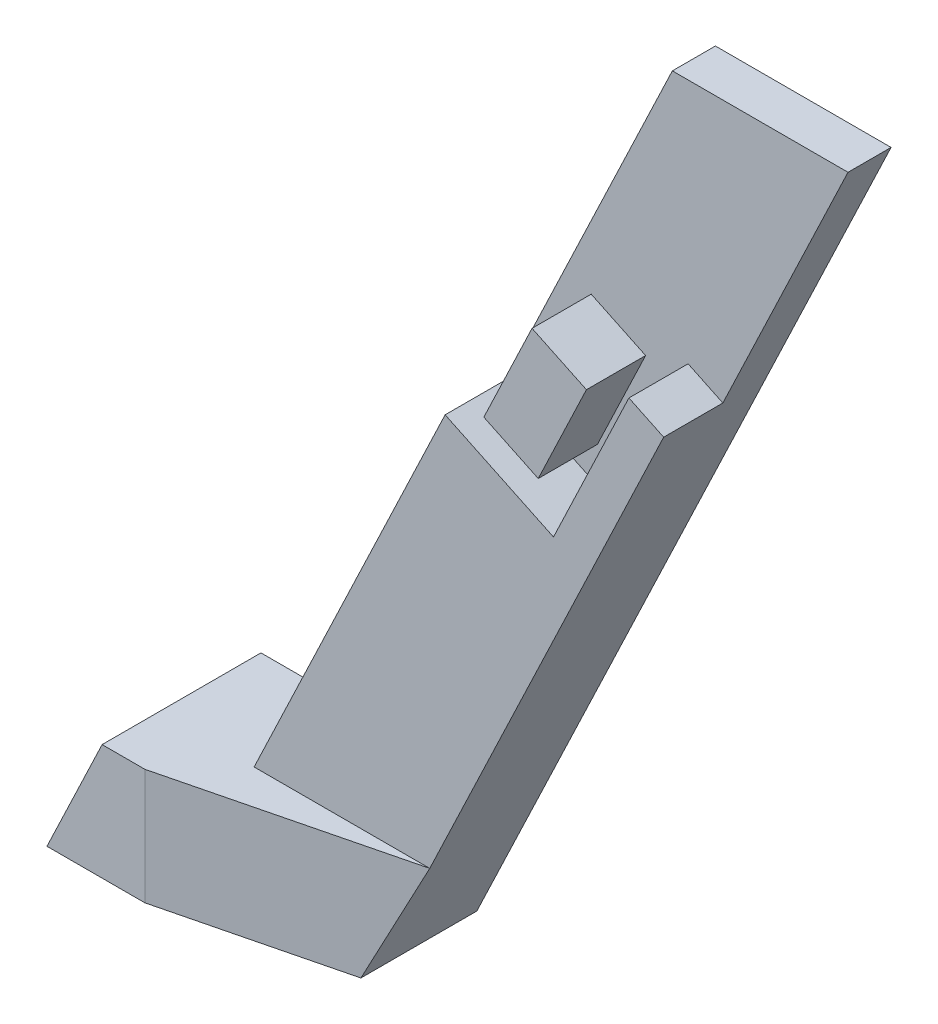
ISO-10303-21;
HEADER;
FILE_DESCRIPTION(('STEP AP214'),'2;1');
FILE_NAME('part.step','',(''),(''),'','','');
FILE_SCHEMA(('AUTOMOTIVE_DESIGN { 1 0 10303 214 1 1 1 1 }'));
ENDSEC;
DATA;
#1=APPLICATION_CONTEXT('core data for automotive mechanical design processes');
#2=APPLICATION_PROTOCOL_DEFINITION('international standard','automotive_design',2000,#1);
#3=PRODUCT_CONTEXT('',#1,'mechanical');
#4=PRODUCT('Part','Part','',(#3));
#5=PRODUCT_RELATED_PRODUCT_CATEGORY('part','',(#4));
#6=PRODUCT_DEFINITION_FORMATION('','',#4);
#7=PRODUCT_DEFINITION_CONTEXT('part definition',#1,'design');
#8=PRODUCT_DEFINITION('design','',#6,#7);
#9=PRODUCT_DEFINITION_SHAPE('','',#8);
#10=(LENGTH_UNIT() NAMED_UNIT(*) SI_UNIT(.MILLI.,.METRE.));
#11=(NAMED_UNIT(*) PLANE_ANGLE_UNIT() SI_UNIT($,.RADIAN.));
#12=(NAMED_UNIT(*) SI_UNIT($,.STERADIAN.) SOLID_ANGLE_UNIT());
#13=UNCERTAINTY_MEASURE_WITH_UNIT(LENGTH_MEASURE(1.E-05),#10,'distance_accuracy_value','');
#14=(GEOMETRIC_REPRESENTATION_CONTEXT(3) GLOBAL_UNCERTAINTY_ASSIGNED_CONTEXT((#13)) GLOBAL_UNIT_ASSIGNED_CONTEXT((#10,
#11,#12)) REPRESENTATION_CONTEXT('',''));
#15=CARTESIAN_POINT('',(0.,0.,0.));
#16=DIRECTION('',(0.,0.,1.));
#17=DIRECTION('',(1.,0.,0.));
#18=AXIS2_PLACEMENT_3D('',#15,#16,#17);
#19=CARTESIAN_POINT('',(6.79806732335556,55.3855791169411,28.9030453567871));
#20=DIRECTION('',(0.,0.,-1.));
#21=DIRECTION('',(-1.,0.,0.));
#22=AXIS2_PLACEMENT_3D('',#19,#20,#21);
#23=PLANE('',#22);
#24=DIRECTION('',(-1.,0.,0.));
#25=VECTOR('',#24,1.);
#26=CARTESIAN_POINT('',(6.79806732335556,45.3855791169411,28.9030453567871));
#27=LINE('',#26,#25);
#28=CARTESIAN_POINT('',(23.1199205917161,45.3855791169411,28.9030453567871));
#29=VERTEX_POINT('',#28);
#30=CARTESIAN_POINT('',(6.79806732335556,45.3855791169411,28.9030453567871));
#31=VERTEX_POINT('',#30);
#32=EDGE_CURVE('E187',#29,#31,#27,.T.);
#33=ORIENTED_EDGE('',*,*,#32,.T.);
#34=DIRECTION('',(-0.43051109680829,-0.902585284349863,0.));
#35=VECTOR('',#34,1.);
#36=CARTESIAN_POINT('',(6.79806732335556,45.3855791169411,28.9030453567871));
#37=LINE('',#36,#35);
#38=CARTESIAN_POINT('',(-8.81560558331229,12.6508331262096,28.9030453567871));
#39=VERTEX_POINT('',#38);
#40=EDGE_CURVE('E192',#31,#39,#37,.T.);
#41=ORIENTED_EDGE('',*,*,#40,.T.);
#42=DIRECTION('',(0.902585284349865,-0.430511096808287,0.));
#43=VECTOR('',#42,1.);
#44=CARTESIAN_POINT('',(3.28188932140938,6.88062404971684,28.9030453567871));
#45=LINE('',#44,#43);
#46=CARTESIAN_POINT('',(1.25181873792912,7.84891804768718,28.9030453567871));
#47=VERTEX_POINT('',#46);
#48=EDGE_CURVE('E214',#39,#47,#45,.T.);
#49=ORIENTED_EDGE('',*,*,#48,.T.);
#50=DIRECTION('',(0.430511106661755,0.902585279650001,0.));
#51=VECTOR('',#50,1.);
#52=CARTESIAN_POINT('',(-2.0300706480248,0.96829405596068,28.9030453567871));
#53=LINE('',#52,#51);
#54=CARTESIAN_POINT('',(8.26092366574488,22.5438117065847,28.9030453567871));
#55=VERTEX_POINT('',#54);
#56=EDGE_CURVE('E223',#47,#55,#53,.T.);
#57=ORIENTED_EDGE('',*,*,#56,.T.);
#58=DIRECTION('',(0.902585284349863,-0.43051109680829,0.));
#59=VECTOR('',#58,1.);
#60=CARTESIAN_POINT('',(10.290994088802,21.5755177851323,28.9030453567871));
#61=LINE('',#60,#59);
#62=CARTESIAN_POINT('',(11.4902633590119,21.0034956861254,28.9030453567871));
#63=VERTEX_POINT('',#62);
#64=EDGE_CURVE('E221',#55,#63,#61,.T.);
#65=ORIENTED_EDGE('',*,*,#64,.T.);
#66=DIRECTION('',(0.430511096808289,0.902585284349863,0.));
#67=VECTOR('',#66,1.);
#68=CARTESIAN_POINT('',(-15.3714022019898,-35.3131573066409,28.9030453567871));
#69=LINE('',#68,#67);
#70=EDGE_CURVE('E196',#63,#29,#69,.T.);
#71=ORIENTED_EDGE('',*,*,#70,.T.);
#72=EDGE_LOOP('',(#33,#41,#49,#57,#65,#71));
#73=FACE_BOUND('',#72,.T.);
#74=DIRECTION('',(0.902585284349863,-0.430511096808291,0.));
#75=VECTOR('',#74,1.);
#76=CARTESIAN_POINT('',(4.57342261183424,9.58837990276632,28.9030453567871));
#77=LINE('',#76,#75);
#78=CARTESIAN_POINT('',(-5.21888141705454,14.2590693332878,28.9030453567871));
#79=VERTEX_POINT('',#78);
#80=CARTESIAN_POINT('',(-0.164403824695319,11.8482071911614,28.9030453567871));
#81=VERTEX_POINT('',#80);
#82=EDGE_CURVE('E306',#79,#81,#77,.T.);
#83=ORIENTED_EDGE('',*,*,#82,.F.);
#84=DIRECTION('',(-0.430511096808287,-0.902585284349865,0.));
#85=VECTOR('',#84,1.);
#86=CARTESIAN_POINT('',(-9.79230402888876,4.67068943052144,28.9030453567871));
#87=LINE('',#86,#85);
#88=CARTESIAN_POINT('',(-0.741566010248357,23.6459562905264,28.9030453567871));
#89=VERTEX_POINT('',#88);
#90=EDGE_CURVE('E216',#89,#79,#87,.T.);
#91=ORIENTED_EDGE('',*,*,#90,.F.);
#92=DIRECTION('',(-0.902585284349863,0.430511096808291,0.));
#93=VECTOR('',#92,1.);
#94=CARTESIAN_POINT('',(9.05073801864047,18.9752668600049,28.9030453567871));
#95=LINE('',#94,#93);
#96=CARTESIAN_POINT('',(4.31291158211089,21.2350941484,28.9030453567871));
#97=VERTEX_POINT('',#96);
#98=EDGE_CURVE('E313',#97,#89,#95,.T.);
#99=ORIENTED_EDGE('',*,*,#98,.F.);
#100=DIRECTION('',(0.430511096808289,0.902585284349863,0.));
#101=VECTOR('',#100,1.);
#102=CARTESIAN_POINT('',(-4.73782643652955,2.25982728839507,28.9030453567871));
#103=LINE('',#102,#101);
#104=EDGE_CURVE('E315',#81,#97,#103,.T.);
#105=ORIENTED_EDGE('',*,*,#104,.F.);
#106=EDGE_LOOP('',(#83,#91,#99,#105));
#107=FACE_BOUND('',#106,.T.);
#108=ADVANCED_FACE('F77',(#73,#107),#23,.F.);
#109=CARTESIAN_POINT('',(6.79806732335556,45.3855791169411,28.9030453567871));
#110=DIRECTION('',(0.,1.,0.));
#111=DIRECTION('',(0.,0.,-1.));
#112=AXIS2_PLACEMENT_3D('',#109,#110,#111);
#113=PLANE('',#112);
#114=DIRECTION('',(-1.,0.,0.));
#115=VECTOR('',#114,1.);
#116=CARTESIAN_POINT('',(6.79806732335556,45.3855791169411,24.9030453567871));
#117=LINE('',#116,#115);
#118=CARTESIAN_POINT('',(23.1199205917161,45.3855791169411,24.9030453567871));
#119=VERTEX_POINT('',#118);
#120=CARTESIAN_POINT('',(6.79806732335556,45.3855791169411,24.9030453567871));
#121=VERTEX_POINT('',#120);
#122=EDGE_CURVE('E204',#119,#121,#117,.T.);
#123=ORIENTED_EDGE('',*,*,#122,.T.);
#124=DIRECTION('',(0.,0.,-1.));
#125=VECTOR('',#124,1.);
#126=CARTESIAN_POINT('',(6.79806732335556,45.3855791169411,28.9030453567871));
#127=LINE('',#126,#125);
#128=EDGE_CURVE('E201',#31,#121,#127,.T.);
#129=ORIENTED_EDGE('',*,*,#128,.F.);
#130=ORIENTED_EDGE('',*,*,#32,.F.);
#131=DIRECTION('',(0.,0.,-1.));
#132=VECTOR('',#131,1.);
#133=CARTESIAN_POINT('',(23.1199205917161,45.3855791169411,28.9030453567871));
#134=LINE('',#133,#132);
#135=EDGE_CURVE('E208',#29,#119,#134,.T.);
#136=ORIENTED_EDGE('',*,*,#135,.T.);
#137=EDGE_LOOP('',(#123,#129,#130,#136));
#138=FACE_BOUND('',#137,.T.);
#139=ADVANCED_FACE('F202',(#138),#113,.T.);
#140=CARTESIAN_POINT('',(-15.3714022019898,-35.3131573066409,28.9030453567871));
#141=DIRECTION('',(0.902585284349863,-0.430511096808289,0.));
#142=DIRECTION('',(0.430511096808289,0.902585284349863,0.));
#143=AXIS2_PLACEMENT_3D('',#140,#141,#142);
#144=PLANE('',#143);
#145=DIRECTION('',(-0.428076885082601,-0.897481853337546,0.10619088184859));
#146=VECTOR('',#145,1.);
#147=CARTESIAN_POINT('',(-15.0635706334285,-34.6677750019764,35.5984835481295));
#148=LINE('',#147,#146);
#149=CARTESIAN_POINT('',(-10.2445179205198,-24.564420883059,34.4030453567871));
#150=VERTEX_POINT('',#149);
#151=CARTESIAN_POINT('',(-15.3714022019898,-35.3131573066409,35.6748457785266));
#152=VERTEX_POINT('',#151);
#153=EDGE_CURVE('E207',#150,#152,#148,.T.);
#154=ORIENTED_EDGE('',*,*,#153,.T.);
#155=DIRECTION('',(0.,0.,-1.));
#156=VECTOR('',#155,1.);
#157=CARTESIAN_POINT('',(-15.3714022019898,-35.3131573066409,28.9030453567871));
#158=LINE('',#157,#156);
#159=CARTESIAN_POINT('',(-15.3714022019898,-35.3131573066409,24.9030453567871));
#160=VERTEX_POINT('',#159);
#161=EDGE_CURVE('E237',#152,#160,#158,.T.);
#162=ORIENTED_EDGE('',*,*,#161,.T.);
#163=DIRECTION('',(0.430511096808289,0.902585284349863,0.));
#164=VECTOR('',#163,1.);
#165=CARTESIAN_POINT('',(-15.3714022019898,-35.3131573066409,24.9030453567871));
#166=LINE('',#165,#164);
#167=EDGE_CURVE('E235',#160,#119,#166,.T.);
#168=ORIENTED_EDGE('',*,*,#167,.T.);
#169=ORIENTED_EDGE('',*,*,#135,.F.);
#170=ORIENTED_EDGE('',*,*,#70,.F.);
#171=DIRECTION('',(0.,0.,-1.));
#172=VECTOR('',#171,1.);
#173=CARTESIAN_POINT('',(11.4902633590119,21.0034956861254,112.225365897655));
#174=LINE('',#173,#172);
#175=CARTESIAN_POINT('',(11.4902633590119,21.0034956861254,34.4030453567871));
#176=VERTEX_POINT('',#175);
#177=EDGE_CURVE('E233',#176,#63,#174,.T.);
#178=ORIENTED_EDGE('',*,*,#177,.F.);
#179=DIRECTION('',(-0.430511096808289,-0.902585284349864,0.));
#180=VECTOR('',#179,1.);
#181=CARTESIAN_POINT('',(1.19926927021,-0.572022099006938,34.4030453567871));
#182=LINE('',#181,#180);
#183=EDGE_CURVE('E230',#176,#150,#182,.T.);
#184=ORIENTED_EDGE('',*,*,#183,.T.);
#185=EDGE_LOOP('',(#154,#162,#168,#169,#170,#178,#184));
#186=FACE_BOUND('',#185,.T.);
#187=ADVANCED_FACE('F339',(#186),#144,.T.);
#188=CARTESIAN_POINT('',(-40.55668382301,-35.3131573066409,28.9030453567871));
#189=DIRECTION('',(0.,-1.,0.));
#190=DIRECTION('',(0.,0.,1.));
#191=AXIS2_PLACEMENT_3D('',#188,#189,#190);
#192=PLANE('',#191);
#193=DIRECTION('',(-0.970582796133083,0.,0.240767597177209));
#194=VECTOR('',#193,1.);
#195=CARTESIAN_POINT('',(-31.4486399349221,-35.3131573066409,39.6630453567871));
#196=LINE('',#195,#194);
#197=CARTESIAN_POINT('',(-31.4486399349221,-35.313157306641,39.6630453567871));
#198=VERTEX_POINT('',#197);
#199=EDGE_CURVE('E240',#152,#198,#196,.T.);
#200=ORIENTED_EDGE('',*,*,#199,.T.);
#201=DIRECTION('',(-1.,0.,0.));
#202=VECTOR('',#201,1.);
#203=CARTESIAN_POINT('',(-15.3714022019898,-35.3131573066409,39.6630453567871));
#204=LINE('',#203,#202);
#205=CARTESIAN_POINT('',(-40.55668382301,-35.313157306641,39.6630453567871));
#206=VERTEX_POINT('',#205);
#207=EDGE_CURVE('E248',#198,#206,#204,.T.);
#208=ORIENTED_EDGE('',*,*,#207,.T.);
#209=DIRECTION('',(0.,0.,-1.));
#210=VECTOR('',#209,1.);
#211=CARTESIAN_POINT('',(-40.55668382301,-35.3131573066409,28.9030453567871));
#212=LINE('',#211,#210);
#213=CARTESIAN_POINT('',(-40.55668382301,-35.3131573066409,24.9030453567871));
#214=VERTEX_POINT('',#213);
#215=EDGE_CURVE('E245',#206,#214,#212,.T.);
#216=ORIENTED_EDGE('',*,*,#215,.T.);
#217=DIRECTION('',(1.,0.,0.));
#218=VECTOR('',#217,1.);
#219=CARTESIAN_POINT('',(-40.55668382301,-35.3131573066409,24.9030453567871));
#220=LINE('',#219,#218);
#221=EDGE_CURVE('E243',#214,#160,#220,.T.);
#222=ORIENTED_EDGE('',*,*,#221,.T.);
#223=ORIENTED_EDGE('',*,*,#161,.F.);
#224=EDGE_LOOP('',(#200,#208,#216,#222,#223));
#225=FACE_BOUND('',#224,.T.);
#226=ADVANCED_FACE('F344',(#225),#192,.T.);
#227=CARTESIAN_POINT('',(-35.4297995415399,-24.564420883059,28.9030453567871));
#228=DIRECTION('',(-0.902585284349863,0.43051109680829,0.));
#229=DIRECTION('',(-0.43051109680829,-0.902585284349863,0.));
#230=AXIS2_PLACEMENT_3D('',#227,#228,#229);
#231=PLANE('',#230);
#232=DIRECTION('',(-0.430511096808289,-0.902585284349863,0.));
#233=VECTOR('',#232,1.);
#234=CARTESIAN_POINT('',(-35.4297995415399,-24.564420883059,24.9030453567871));
#235=LINE('',#234,#233);
#236=CARTESIAN_POINT('',(-35.4297995415399,-24.564420883059,24.9030453567871));
#237=VERTEX_POINT('',#236);
#238=EDGE_CURVE('E251',#237,#214,#235,.T.);
#239=ORIENTED_EDGE('',*,*,#238,.T.);
#240=ORIENTED_EDGE('',*,*,#215,.F.);
#241=DIRECTION('',(0.430511096808289,0.902585284349863,0.));
#242=VECTOR('',#241,1.);
#243=CARTESIAN_POINT('',(-40.55668382301,-35.313157306641,39.6630453567871));
#244=LINE('',#243,#242);
#245=CARTESIAN_POINT('',(-35.4297995415399,-24.564420883059,39.6630453567871));
#246=VERTEX_POINT('',#245);
#247=EDGE_CURVE('E256',#206,#246,#244,.T.);
#248=ORIENTED_EDGE('',*,*,#247,.T.);
#249=DIRECTION('',(0.,0.,-1.));
#250=VECTOR('',#249,1.);
#251=CARTESIAN_POINT('',(-35.4297995415399,-24.564420883059,28.9030453567871));
#252=LINE('',#251,#250);
#253=EDGE_CURVE('E253',#246,#237,#252,.T.);
#254=ORIENTED_EDGE('',*,*,#253,.T.);
#255=EDGE_LOOP('',(#239,#240,#248,#254));
#256=FACE_BOUND('',#255,.T.);
#257=ADVANCED_FACE('F350',(#256),#231,.T.);
#258=CARTESIAN_POINT('',(-26.5663711888802,-24.564420883059,28.9030453567871));
#259=DIRECTION('',(0.,1.,0.));
#260=DIRECTION('',(0.,0.,-1.));
#261=AXIS2_PLACEMENT_3D('',#258,#259,#260);
#262=PLANE('',#261);
#263=DIRECTION('',(0.970582796133083,0.,-0.240767597177209));
#264=VECTOR('',#263,1.);
#265=CARTESIAN_POINT('',(-24.3349422093445,-24.564420883059,37.8983861074618));
#266=LINE('',#265,#264);
#267=CARTESIAN_POINT('',(-31.4486399349221,-24.564420883059,39.6630453567871));
#268=VERTEX_POINT('',#267);
#269=EDGE_CURVE('E259',#268,#150,#266,.T.);
#270=ORIENTED_EDGE('',*,*,#269,.T.);
#271=DIRECTION('',(1.,0.,0.));
#272=VECTOR('',#271,1.);
#273=CARTESIAN_POINT('',(-35.4297995415399,-24.564420883059,34.4030453567871));
#274=LINE('',#273,#272);
#275=CARTESIAN_POINT('',(-26.5663711888802,-24.564420883059,34.4030453567871));
#276=VERTEX_POINT('',#275);
#277=EDGE_CURVE('E270',#276,#150,#274,.T.);
#278=ORIENTED_EDGE('',*,*,#277,.F.);
#279=DIRECTION('',(0.,0.,-1.));
#280=VECTOR('',#279,1.);
#281=CARTESIAN_POINT('',(-26.5663711888802,-24.564420883059,28.9030453567871));
#282=LINE('',#281,#280);
#283=CARTESIAN_POINT('',(-26.5663711888802,-24.564420883059,24.9030453567871));
#284=VERTEX_POINT('',#283);
#285=EDGE_CURVE('E267',#276,#284,#282,.T.);
#286=ORIENTED_EDGE('',*,*,#285,.T.);
#287=DIRECTION('',(-1.,0.,0.));
#288=VECTOR('',#287,1.);
#289=CARTESIAN_POINT('',(-26.5663711888802,-24.564420883059,24.9030453567871));
#290=LINE('',#289,#288);
#291=EDGE_CURVE('E265',#284,#237,#290,.T.);
#292=ORIENTED_EDGE('',*,*,#291,.T.);
#293=ORIENTED_EDGE('',*,*,#253,.F.);
#294=DIRECTION('',(1.,0.,0.));
#295=VECTOR('',#294,1.);
#296=CARTESIAN_POINT('',(-35.4297995415399,-24.564420883059,39.6630453567871));
#297=LINE('',#296,#295);
#298=EDGE_CURVE('E262',#246,#268,#297,.T.);
#299=ORIENTED_EDGE('',*,*,#298,.T.);
#300=EDGE_LOOP('',(#270,#278,#286,#292,#293,#299));
#301=FACE_BOUND('',#300,.T.);
#302=ADVANCED_FACE('F354',(#301),#262,.T.);
#303=CARTESIAN_POINT('',(6.79806732335556,45.3855791169411,28.9030453567871));
#304=DIRECTION('',(-0.902585284349863,0.43051109680829,0.));
#305=DIRECTION('',(-0.43051109680829,-0.902585284349863,0.));
#306=AXIS2_PLACEMENT_3D('',#303,#304,#305);
#307=PLANE('',#306);
#308=DIRECTION('',(-0.43051109680829,-0.902585284349863,0.));
#309=VECTOR('',#308,1.);
#310=CARTESIAN_POINT('',(6.79806732335556,45.3855791169411,24.9030453567871));
#311=LINE('',#310,#309);
#312=EDGE_CURVE('E272',#121,#284,#311,.T.);
#313=ORIENTED_EDGE('',*,*,#312,.T.);
#314=ORIENTED_EDGE('',*,*,#285,.F.);
#315=DIRECTION('',(0.43051109680829,0.902585284349863,0.));
#316=VECTOR('',#315,1.);
#317=CARTESIAN_POINT('',(-12.0974949047217,5.77020907649281,34.4030453567871));
#318=LINE('',#317,#316);
#319=CARTESIAN_POINT('',(-8.81560558331229,12.6508331262096,34.4030453567871));
#320=VERTEX_POINT('',#319);
#321=EDGE_CURVE('E275',#276,#320,#318,.T.);
#322=ORIENTED_EDGE('',*,*,#321,.T.);
#323=DIRECTION('',(0.,0.,-1.));
#324=VECTOR('',#323,1.);
#325=CARTESIAN_POINT('',(-8.81560558331229,12.6508331262096,112.225365897655));
#326=LINE('',#325,#324);
#327=EDGE_CURVE('E213',#320,#39,#326,.T.);
#328=ORIENTED_EDGE('',*,*,#327,.T.);
#329=ORIENTED_EDGE('',*,*,#40,.F.);
#330=ORIENTED_EDGE('',*,*,#128,.T.);
#331=EDGE_LOOP('',(#313,#314,#322,#328,#329,#330));
#332=FACE_BOUND('',#331,.T.);
#333=ADVANCED_FACE('F210',(#332),#307,.T.);
#334=CARTESIAN_POINT('',(0.,0.,24.9030453567871));
#335=DIRECTION('',(0.,0.,-1.));
#336=DIRECTION('',(1.,0.,0.));
#337=AXIS2_PLACEMENT_3D('',#334,#335,#336);
#338=PLANE('',#337);
#339=ORIENTED_EDGE('',*,*,#312,.F.);
#340=ORIENTED_EDGE('',*,*,#122,.F.);
#341=ORIENTED_EDGE('',*,*,#167,.F.);
#342=ORIENTED_EDGE('',*,*,#221,.F.);
#343=ORIENTED_EDGE('',*,*,#238,.F.);
#344=ORIENTED_EDGE('',*,*,#291,.F.);
#345=EDGE_LOOP('',(#339,#340,#341,#342,#343,#344));
#346=FACE_BOUND('',#345,.T.);
#347=ADVANCED_FACE('F361',(#346),#338,.T.);
#348=CARTESIAN_POINT('',(-2.0300706480248,0.96829405596068,112.225365897655));
#349=DIRECTION('',(0.902585279650001,-0.430511106661755,0.));
#350=DIRECTION('',(0.430511106661755,0.902585279650001,0.));
#351=AXIS2_PLACEMENT_3D('',#348,#349,#350);
#352=PLANE('',#351);
#353=DIRECTION('',(0.430511106661755,0.902585279650001,0.));
#354=VECTOR('',#353,1.);
#355=CARTESIAN_POINT('',(-2.0300706480248,0.96829405596068,34.4030453567871));
#356=LINE('',#355,#354);
#357=CARTESIAN_POINT('',(1.25181873792912,7.84891804768718,34.4030453567871));
#358=VERTEX_POINT('',#357);
#359=CARTESIAN_POINT('',(8.26092366574488,22.5438117065847,34.4030453567871));
#360=VERTEX_POINT('',#359);
#361=EDGE_CURVE('E277',#358,#360,#356,.T.);
#362=ORIENTED_EDGE('',*,*,#361,.T.);
#363=DIRECTION('',(0.,0.,-1.));
#364=VECTOR('',#363,1.);
#365=CARTESIAN_POINT('',(8.26092366574488,22.5438117065847,112.225365897655));
#366=LINE('',#365,#364);
#367=EDGE_CURVE('E282',#360,#55,#366,.T.);
#368=ORIENTED_EDGE('',*,*,#367,.T.);
#369=ORIENTED_EDGE('',*,*,#56,.F.);
#370=DIRECTION('',(0.,0.,-1.));
#371=VECTOR('',#370,1.);
#372=CARTESIAN_POINT('',(1.25181873792912,7.84891804768718,112.225365897655));
#373=LINE('',#372,#371);
#374=EDGE_CURVE('E280',#358,#47,#373,.T.);
#375=ORIENTED_EDGE('',*,*,#374,.F.);
#376=EDGE_LOOP('',(#362,#368,#369,#375));
#377=FACE_BOUND('',#376,.T.);
#378=ADVANCED_FACE('F364',(#377),#352,.F.);
#379=CARTESIAN_POINT('',(10.290994088802,21.5755177851323,112.225365897655));
#380=DIRECTION('',(-0.43051109680829,-0.902585284349863,0.));
#381=DIRECTION('',(0.902585284349863,-0.43051109680829,0.));
#382=AXIS2_PLACEMENT_3D('',#379,#380,#381);
#383=PLANE('',#382);
#384=DIRECTION('',(0.902585284349863,-0.43051109680829,0.));
#385=VECTOR('',#384,1.);
#386=CARTESIAN_POINT('',(10.290994088802,21.5755177851323,34.4030453567871));
#387=LINE('',#386,#385);
#388=EDGE_CURVE('E284',#360,#176,#387,.T.);
#389=ORIENTED_EDGE('',*,*,#388,.T.);
#390=ORIENTED_EDGE('',*,*,#177,.T.);
#391=ORIENTED_EDGE('',*,*,#64,.F.);
#392=ORIENTED_EDGE('',*,*,#367,.F.);
#393=EDGE_LOOP('',(#389,#390,#391,#392));
#394=FACE_BOUND('',#393,.T.);
#395=ADVANCED_FACE('F368',(#394),#383,.F.);
#396=CARTESIAN_POINT('',(3.28188932140938,6.88062404971684,112.225365897655));
#397=DIRECTION('',(-0.430511096808287,-0.902585284349865,0.));
#398=DIRECTION('',(0.902585284349865,-0.430511096808287,0.));
#399=AXIS2_PLACEMENT_3D('',#396,#397,#398);
#400=PLANE('',#399);
#401=DIRECTION('',(0.902585284349865,-0.430511096808287,0.));
#402=VECTOR('',#401,1.);
#403=CARTESIAN_POINT('',(3.28188932140938,6.88062404971684,34.4030453567871));
#404=LINE('',#403,#402);
#405=EDGE_CURVE('E286',#320,#358,#404,.T.);
#406=ORIENTED_EDGE('',*,*,#405,.T.);
#407=ORIENTED_EDGE('',*,*,#374,.T.);
#408=ORIENTED_EDGE('',*,*,#48,.F.);
#409=ORIENTED_EDGE('',*,*,#327,.F.);
#410=EDGE_LOOP('',(#406,#407,#408,#409));
#411=FACE_BOUND('',#410,.T.);
#412=ADVANCED_FACE('F332',(#411),#400,.F.);
#413=CARTESIAN_POINT('',(213.987439478169,-44.7724938473252,34.4030453567871));
#414=DIRECTION('',(0.,0.,1.));
#415=DIRECTION('',(1.,0.,0.));
#416=AXIS2_PLACEMENT_3D('',#413,#414,#415);
#417=PLANE('',#416);
#418=ORIENTED_EDGE('',*,*,#183,.F.);
#419=ORIENTED_EDGE('',*,*,#388,.F.);
#420=ORIENTED_EDGE('',*,*,#361,.F.);
#421=ORIENTED_EDGE('',*,*,#405,.F.);
#422=ORIENTED_EDGE('',*,*,#321,.F.);
#423=ORIENTED_EDGE('',*,*,#277,.T.);
#424=EDGE_LOOP('',(#418,#419,#420,#421,#422,#423));
#425=FACE_BOUND('',#424,.T.);
#426=ADVANCED_FACE('F325',(#425),#417,.T.);
#427=CARTESIAN_POINT('',(213.987439478169,-44.7724938473252,34.4030453567871));
#428=DIRECTION('',(0.,0.,1.));
#429=DIRECTION('',(1.,0.,0.));
#430=AXIS2_PLACEMENT_3D('',#427,#428,#429);
#431=PLANE('',#430);
#432=DIRECTION('',(0.902585284349863,-0.430511096808291,0.));
#433=VECTOR('',#432,1.);
#434=CARTESIAN_POINT('',(4.57342261183424,9.58837990276632,34.4030453567871));
#435=LINE('',#434,#433);
#436=CARTESIAN_POINT('',(-5.21888141705454,14.2590693332878,34.4030453567871));
#437=VERTEX_POINT('',#436);
#438=CARTESIAN_POINT('',(-0.164403824695319,11.8482071911614,34.4030453567871));
#439=VERTEX_POINT('',#438);
#440=EDGE_CURVE('E288',#437,#439,#435,.T.);
#441=ORIENTED_EDGE('',*,*,#440,.T.);
#442=DIRECTION('',(0.43051109680829,0.902585284349864,0.));
#443=VECTOR('',#442,1.);
#444=CARTESIAN_POINT('',(-4.73782643652955,2.25982728839507,34.4030453567871));
#445=LINE('',#444,#443);
#446=CARTESIAN_POINT('',(4.31291158211089,21.2350941484,34.4030453567871));
#447=VERTEX_POINT('',#446);
#448=EDGE_CURVE('E297',#439,#447,#445,.T.);
#449=ORIENTED_EDGE('',*,*,#448,.T.);
#450=DIRECTION('',(-0.902585284349863,0.430511096808291,0.));
#451=VECTOR('',#450,1.);
#452=CARTESIAN_POINT('',(9.05073801864047,18.9752668600049,34.4030453567871));
#453=LINE('',#452,#451);
#454=CARTESIAN_POINT('',(-0.741566010248357,23.6459562905264,34.4030453567871));
#455=VERTEX_POINT('',#454);
#456=EDGE_CURVE('E294',#447,#455,#453,.T.);
#457=ORIENTED_EDGE('',*,*,#456,.T.);
#458=DIRECTION('',(-0.430511096808287,-0.902585284349865,0.));
#459=VECTOR('',#458,1.);
#460=CARTESIAN_POINT('',(-9.79230402888876,4.67068943052144,34.4030453567871));
#461=LINE('',#460,#459);
#462=EDGE_CURVE('E291',#455,#437,#461,.T.);
#463=ORIENTED_EDGE('',*,*,#462,.T.);
#464=EDGE_LOOP('',(#441,#449,#457,#463));
#465=FACE_BOUND('',#464,.T.);
#466=ADVANCED_FACE('F323',(#465),#431,.T.);
#467=CARTESIAN_POINT('',(-4.73782643652955,2.25982728839507,112.225365897655));
#468=DIRECTION('',(0.902585284349863,-0.430511096808289,0.));
#469=DIRECTION('',(0.43051109680829,0.902585284349864,0.));
#470=AXIS2_PLACEMENT_3D('',#467,#468,#469);
#471=PLANE('',#470);
#472=DIRECTION('',(0.,0.,-1.));
#473=VECTOR('',#472,1.);
#474=CARTESIAN_POINT('',(-0.164403824695319,11.8482071911614,112.225365897655));
#475=LINE('',#474,#473);
#476=EDGE_CURVE('E91',#439,#81,#475,.T.);
#477=ORIENTED_EDGE('',*,*,#476,.T.);
#478=ORIENTED_EDGE('',*,*,#104,.T.);
#479=DIRECTION('',(0.,0.,-1.));
#480=VECTOR('',#479,1.);
#481=CARTESIAN_POINT('',(4.31291158211089,21.2350941484,112.225365897655));
#482=LINE('',#481,#480);
#483=EDGE_CURVE('E98',#447,#97,#482,.T.);
#484=ORIENTED_EDGE('',*,*,#483,.F.);
#485=ORIENTED_EDGE('',*,*,#448,.F.);
#486=EDGE_LOOP('',(#477,#478,#484,#485));
#487=FACE_BOUND('',#486,.T.);
#488=ADVANCED_FACE('F321',(#487),#471,.T.);
#489=CARTESIAN_POINT('',(9.05073801864047,18.9752668600049,112.225365897655));
#490=DIRECTION('',(0.430511096808291,0.902585284349863,0.));
#491=DIRECTION('',(-0.902585284349863,0.430511096808291,0.));
#492=AXIS2_PLACEMENT_3D('',#489,#490,#491);
#493=PLANE('',#492);
#494=ORIENTED_EDGE('',*,*,#483,.T.);
#495=ORIENTED_EDGE('',*,*,#98,.T.);
#496=DIRECTION('',(0.,0.,-1.));
#497=VECTOR('',#496,1.);
#498=CARTESIAN_POINT('',(-0.741566010248357,23.6459562905264,112.225365897655));
#499=LINE('',#498,#497);
#500=EDGE_CURVE('E302',#455,#89,#499,.T.);
#501=ORIENTED_EDGE('',*,*,#500,.F.);
#502=ORIENTED_EDGE('',*,*,#456,.F.);
#503=EDGE_LOOP('',(#494,#495,#501,#502));
#504=FACE_BOUND('',#503,.T.);
#505=ADVANCED_FACE('F320',(#504),#493,.T.);
#506=CARTESIAN_POINT('',(-9.79230402888876,4.67068943052144,112.225365897655));
#507=DIRECTION('',(-0.902585284349865,0.430511096808287,0.));
#508=DIRECTION('',(-0.430511096808287,-0.902585284349865,0.));
#509=AXIS2_PLACEMENT_3D('',#506,#507,#508);
#510=PLANE('',#509);
#511=ORIENTED_EDGE('',*,*,#500,.T.);
#512=ORIENTED_EDGE('',*,*,#90,.T.);
#513=DIRECTION('',(0.,0.,-1.));
#514=VECTOR('',#513,1.);
#515=CARTESIAN_POINT('',(-5.21888141705454,14.2590693332878,112.225365897655));
#516=LINE('',#515,#514);
#517=EDGE_CURVE('E84',#437,#79,#516,.T.);
#518=ORIENTED_EDGE('',*,*,#517,.F.);
#519=ORIENTED_EDGE('',*,*,#462,.F.);
#520=EDGE_LOOP('',(#511,#512,#518,#519));
#521=FACE_BOUND('',#520,.T.);
#522=ADVANCED_FACE('F310',(#521),#510,.T.);
#523=CARTESIAN_POINT('',(4.57342261183424,9.58837990276632,112.225365897655));
#524=DIRECTION('',(-0.430511096808291,-0.902585284349863,0.));
#525=DIRECTION('',(0.902585284349863,-0.430511096808291,0.));
#526=AXIS2_PLACEMENT_3D('',#523,#524,#525);
#527=PLANE('',#526);
#528=ORIENTED_EDGE('',*,*,#517,.T.);
#529=ORIENTED_EDGE('',*,*,#82,.T.);
#530=ORIENTED_EDGE('',*,*,#476,.F.);
#531=ORIENTED_EDGE('',*,*,#440,.F.);
#532=EDGE_LOOP('',(#528,#529,#530,#531));
#533=FACE_BOUND('',#532,.T.);
#534=ADVANCED_FACE('F304',(#533),#527,.T.);
#535=CARTESIAN_POINT('',(0.,0.,39.6630453567871));
#536=DIRECTION('',(0.,0.,1.));
#537=DIRECTION('',(-1.,0.,0.));
#538=AXIS2_PLACEMENT_3D('',#535,#536,#537);
#539=PLANE('',#538);
#540=DIRECTION('',(0.,1.,0.));
#541=VECTOR('',#540,1.);
#542=CARTESIAN_POINT('',(-31.4486399349221,0.,39.6630453567871));
#543=LINE('',#542,#541);
#544=EDGE_CURVE('E12',#198,#268,#543,.T.);
#545=ORIENTED_EDGE('',*,*,#544,.T.);
#546=ORIENTED_EDGE('',*,*,#298,.F.);
#547=ORIENTED_EDGE('',*,*,#247,.F.);
#548=ORIENTED_EDGE('',*,*,#207,.F.);
#549=EDGE_LOOP('',(#545,#546,#547,#548));
#550=FACE_BOUND('',#549,.T.);
#551=ADVANCED_FACE('F399',(#550),#539,.T.);
#552=CARTESIAN_POINT('',(-31.4486399349221,-10.0531573066409,39.6630453567871));
#553=DIRECTION('',(-0.240767597177209,0.,-0.970582796133083));
#554=DIRECTION('',(0.970582796133083,0.,-0.240767597177209));
#555=AXIS2_PLACEMENT_3D('',#552,#553,#554);
#556=PLANE('',#555);
#557=ORIENTED_EDGE('',*,*,#153,.F.);
#558=ORIENTED_EDGE('',*,*,#269,.F.);
#559=ORIENTED_EDGE('',*,*,#544,.F.);
#560=ORIENTED_EDGE('',*,*,#199,.F.);
#561=EDGE_LOOP('',(#557,#558,#559,#560));
#562=FACE_BOUND('',#561,.T.);
#563=ADVANCED_FACE('F394',(#562),#556,.F.);
#564=CLOSED_SHELL('',(#108,#139,#187,#226,#257,#302,#333,#347,#378,#395,#412,#426,#466,#488,
#505,#522,#534,#551,#563));
#565=MANIFOLD_SOLID_BREP('B2',#564);
#566=ADVANCED_BREP_SHAPE_REPRESENTATION('',(#18,#565),#14);
#567=SHAPE_DEFINITION_REPRESENTATION(#9,#566);
ENDSEC;
END-ISO-10303-21;
